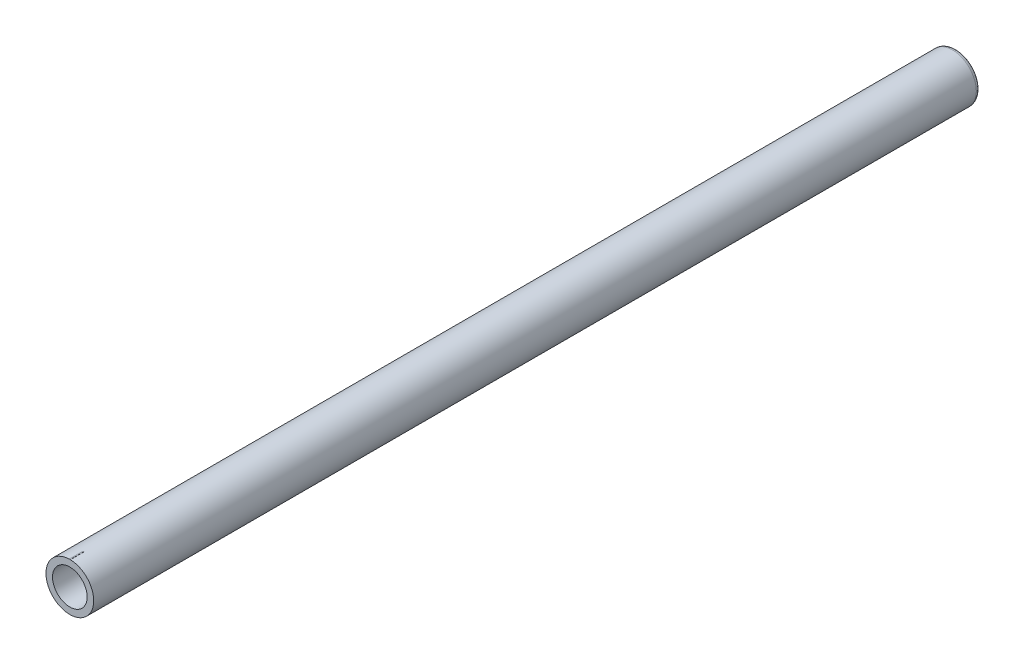
ISO-10303-21;
HEADER;
FILE_DESCRIPTION(('STEP AP214'),'2;1');
FILE_NAME('part.step','',(''),(''),'','','');
FILE_SCHEMA(('AUTOMOTIVE_DESIGN { 1 0 10303 214 1 1 1 1 }'));
ENDSEC;
DATA;
#1=APPLICATION_CONTEXT('core data for automotive mechanical design processes');
#2=APPLICATION_PROTOCOL_DEFINITION('international standard','automotive_design',2000,#1);
#3=PRODUCT_CONTEXT('',#1,'mechanical');
#4=PRODUCT('Part','Part','',(#3));
#5=PRODUCT_RELATED_PRODUCT_CATEGORY('part','',(#4));
#6=PRODUCT_DEFINITION_FORMATION('','',#4);
#7=PRODUCT_DEFINITION_CONTEXT('part definition',#1,'design');
#8=PRODUCT_DEFINITION('design','',#6,#7);
#9=PRODUCT_DEFINITION_SHAPE('','',#8);
#10=(LENGTH_UNIT() NAMED_UNIT(*) SI_UNIT(.MILLI.,.METRE.));
#11=(NAMED_UNIT(*) PLANE_ANGLE_UNIT() SI_UNIT($,.RADIAN.));
#12=(NAMED_UNIT(*) SI_UNIT($,.STERADIAN.) SOLID_ANGLE_UNIT());
#13=UNCERTAINTY_MEASURE_WITH_UNIT(LENGTH_MEASURE(1.E-05),#10,'distance_accuracy_value','');
#14=(GEOMETRIC_REPRESENTATION_CONTEXT(3) GLOBAL_UNCERTAINTY_ASSIGNED_CONTEXT((#13)) GLOBAL_UNIT_ASSIGNED_CONTEXT((#10,
#11,#12)) REPRESENTATION_CONTEXT('',''));
#15=CARTESIAN_POINT('',(0.,0.,0.));
#16=DIRECTION('',(0.,0.,1.));
#17=DIRECTION('',(1.,0.,0.));
#18=AXIS2_PLACEMENT_3D('',#15,#16,#17);
#19=CARTESIAN_POINT('',(0.,0.,-650.));
#20=DIRECTION('',(0.,0.,1.));
#21=DIRECTION('',(1.,0.,0.));
#22=AXIS2_PLACEMENT_3D('',#19,#20,#21);
#23=CYLINDRICAL_SURFACE('',#22,17.5);
#24=DIRECTION('',(0.,0.,1.));
#25=VECTOR('',#24,1.);
#26=CARTESIAN_POINT('',(0.367368750009311,17.4961435808442,-650.));
#27=LINE('',#26,#25);
#28=CARTESIAN_POINT('',(0.367368750009311,17.4961435808442,0.));
#29=VERTEX_POINT('',#28);
#30=CARTESIAN_POINT('',(0.367368750009311,17.4961435808442,-10.));
#31=VERTEX_POINT('',#30);
#32=EDGE_CURVE('E58',#29,#31,#27,.F.);
#33=ORIENTED_EDGE('',*,*,#32,.F.);
#34=CARTESIAN_POINT('',(0.,0.,0.));
#35=DIRECTION('',(0.,0.,1.));
#36=DIRECTION('',(1.,0.,0.));
#37=AXIS2_PLACEMENT_3D('',#34,#35,#36);
#38=CIRCLE('',#37,17.5);
#39=CARTESIAN_POINT('',(-0.367368750009311,17.4961435808442,0.));
#40=VERTEX_POINT('',#39);
#41=EDGE_CURVE('E110',#40,#29,#38,.T.);
#42=ORIENTED_EDGE('',*,*,#41,.F.);
#43=DIRECTION('',(0.,0.,1.));
#44=VECTOR('',#43,1.);
#45=CARTESIAN_POINT('',(-0.367368750009311,17.4961435808442,-650.));
#46=LINE('',#45,#44);
#47=CARTESIAN_POINT('',(-0.367368750009311,17.4961435808442,-10.));
#48=VERTEX_POINT('',#47);
#49=EDGE_CURVE('E102',#48,#40,#46,.T.);
#50=ORIENTED_EDGE('',*,*,#49,.F.);
#51=CARTESIAN_POINT('',(0.,0.,-10.));
#52=DIRECTION('',(0.,0.,1.));
#53=DIRECTION('',(1.,0.,0.));
#54=AXIS2_PLACEMENT_3D('',#51,#52,#53);
#55=CIRCLE('',#54,17.5);
#56=EDGE_CURVE('E11',#48,#31,#55,.F.);
#57=ORIENTED_EDGE('',*,*,#56,.T.);
#58=EDGE_LOOP('',(#33,#42,#50,#57));
#59=FACE_BOUND('',#58,.T.);
#60=CARTESIAN_POINT('',(0.,0.,-647.));
#61=DIRECTION('',(0.,0.,1.));
#62=DIRECTION('',(1.,0.,0.));
#63=AXIS2_PLACEMENT_3D('',#60,#61,#62);
#64=CIRCLE('',#63,17.5);
#65=CARTESIAN_POINT('',(17.5,0.,-647.));
#66=VERTEX_POINT('',#65);
#67=EDGE_CURVE('E114',#66,#66,#64,.T.);
#68=ORIENTED_EDGE('',*,*,#67,.T.);
#69=EDGE_LOOP('',(#68));
#70=FACE_BOUND('',#69,.T.);
#71=ADVANCED_FACE('F35',(#59,#70),#23,.T.);
#72=CARTESIAN_POINT('',(0.,0.,-650.));
#73=DIRECTION('',(0.,0.,1.));
#74=DIRECTION('',(1.,0.,0.));
#75=AXIS2_PLACEMENT_3D('',#72,#73,#74);
#76=PLANE('',#75);
#77=CARTESIAN_POINT('',(0.,0.,-650.));
#78=DIRECTION('',(0.,0.,1.));
#79=DIRECTION('',(1.,0.,0.));
#80=AXIS2_PLACEMENT_3D('',#77,#78,#79);
#81=CIRCLE('',#80,14.5);
#82=CARTESIAN_POINT('',(14.5,0.,-650.));
#83=VERTEX_POINT('',#82);
#84=EDGE_CURVE('E43',#83,#83,#81,.F.);
#85=ORIENTED_EDGE('',*,*,#84,.T.);
#86=EDGE_LOOP('',(#85));
#87=FACE_BOUND('',#86,.T.);
#88=ADVANCED_FACE('F119',(#87),#76,.F.);
#89=CARTESIAN_POINT('',(0.,0.,0.));
#90=DIRECTION('',(0.,0.,1.));
#91=DIRECTION('',(1.,0.,0.));
#92=AXIS2_PLACEMENT_3D('',#89,#90,#91);
#93=PLANE('',#92);
#94=ORIENTED_EDGE('',*,*,#41,.T.);
#95=DIRECTION('',(0.,1.,0.));
#96=VECTOR('',#95,1.);
#97=CARTESIAN_POINT('',(0.367368750009311,17.5943090338643,0.));
#98=LINE('',#97,#96);
#99=CARTESIAN_POINT('',(0.367368750009311,17.5943090338643,0.));
#100=VERTEX_POINT('',#99);
#101=EDGE_CURVE('E98',#29,#100,#98,.T.);
#102=ORIENTED_EDGE('',*,*,#101,.T.);
#103=DIRECTION('',(-1.,0.,0.));
#104=VECTOR('',#103,1.);
#105=CARTESIAN_POINT('',(-0.367368750009311,17.5943090338643,0.));
#106=LINE('',#105,#104);
#107=CARTESIAN_POINT('',(-0.367368750009311,17.5943090338643,0.));
#108=VERTEX_POINT('',#107);
#109=EDGE_CURVE('E88',#100,#108,#106,.T.);
#110=ORIENTED_EDGE('',*,*,#109,.T.);
#111=DIRECTION('',(0.,-1.,0.));
#112=VECTOR('',#111,1.);
#113=CARTESIAN_POINT('',(-0.367368750009311,17.5943090338643,0.));
#114=LINE('',#113,#112);
#115=EDGE_CURVE('E50',#108,#40,#114,.T.);
#116=ORIENTED_EDGE('',*,*,#115,.T.);
#117=EDGE_LOOP('',(#94,#102,#110,#116));
#118=FACE_BOUND('',#117,.T.);
#119=CARTESIAN_POINT('',(0.,0.,0.));
#120=DIRECTION('',(0.,0.,1.));
#121=DIRECTION('',(1.,0.,0.));
#122=AXIS2_PLACEMENT_3D('',#119,#120,#121);
#123=CIRCLE('',#122,12.7);
#124=CARTESIAN_POINT('',(12.7,0.,0.));
#125=VERTEX_POINT('',#124);
#126=EDGE_CURVE('E106',#125,#125,#123,.T.);
#127=ORIENTED_EDGE('',*,*,#126,.F.);
#128=EDGE_LOOP('',(#127));
#129=FACE_BOUND('',#128,.T.);
#130=ADVANCED_FACE('F133',(#118,#129),#93,.T.);
#131=CARTESIAN_POINT('',(0.,0.,-640.));
#132=DIRECTION('',(0.,0.,1.));
#133=DIRECTION('',(1.,0.,0.));
#134=AXIS2_PLACEMENT_3D('',#131,#132,#133);
#135=CYLINDRICAL_SURFACE('',#134,12.7);
#136=CARTESIAN_POINT('',(0.,0.,-640.));
#137=DIRECTION('',(0.,0.,1.));
#138=DIRECTION('',(1.,0.,0.));
#139=AXIS2_PLACEMENT_3D('',#136,#137,#138);
#140=CIRCLE('',#139,12.7);
#141=CARTESIAN_POINT('',(12.7,0.,-640.));
#142=VERTEX_POINT('',#141);
#143=EDGE_CURVE('E107',#142,#142,#140,.T.);
#144=ORIENTED_EDGE('',*,*,#143,.F.);
#145=EDGE_LOOP('',(#144));
#146=FACE_BOUND('',#145,.T.);
#147=ORIENTED_EDGE('',*,*,#126,.T.);
#148=EDGE_LOOP('',(#147));
#149=FACE_BOUND('',#148,.T.);
#150=ADVANCED_FACE('F137',(#146,#149),#135,.F.);
#151=CARTESIAN_POINT('',(0.,0.,-640.));
#152=DIRECTION('',(0.,0.,1.));
#153=DIRECTION('',(1.,0.,0.));
#154=AXIS2_PLACEMENT_3D('',#151,#152,#153);
#155=PLANE('',#154);
#156=ORIENTED_EDGE('',*,*,#143,.T.);
#157=EDGE_LOOP('',(#156));
#158=FACE_BOUND('',#157,.T.);
#159=ADVANCED_FACE('F123',(#158),#155,.T.);
#160=CARTESIAN_POINT('',(0.,0.,-647.));
#161=DIRECTION('',(0.,0.,1.));
#162=DIRECTION('',(1.,0.,0.));
#163=AXIS2_PLACEMENT_3D('',#160,#161,#162);
#164=TOROIDAL_SURFACE('',#163,14.5,3.);
#165=ORIENTED_EDGE('',*,*,#84,.F.);
#166=EDGE_LOOP('',(#165));
#167=FACE_BOUND('',#166,.T.);
#168=ORIENTED_EDGE('',*,*,#67,.F.);
#169=EDGE_LOOP('',(#168));
#170=FACE_BOUND('',#169,.T.);
#171=ADVANCED_FACE('F37',(#167,#170),#164,.T.);
#172=CARTESIAN_POINT('',(0.367368750009311,17.5943090338643,-10.));
#173=DIRECTION('',(1.,0.,0.));
#174=DIRECTION('',(0.,0.,-1.));
#175=AXIS2_PLACEMENT_3D('',#172,#173,#174);
#176=PLANE('',#175);
#177=ORIENTED_EDGE('',*,*,#101,.F.);
#178=ORIENTED_EDGE('',*,*,#32,.T.);
#179=DIRECTION('',(0.,1.,0.));
#180=VECTOR('',#179,1.);
#181=CARTESIAN_POINT('',(0.367368750009311,17.5943090338643,-10.));
#182=LINE('',#181,#180);
#183=CARTESIAN_POINT('',(0.367368750009311,17.5943090338643,-10.));
#184=VERTEX_POINT('',#183);
#185=EDGE_CURVE('E76',#31,#184,#182,.T.);
#186=ORIENTED_EDGE('',*,*,#185,.T.);
#187=DIRECTION('',(0.,0.,1.));
#188=VECTOR('',#187,1.);
#189=CARTESIAN_POINT('',(0.367368750009311,17.5943090338643,-10.));
#190=LINE('',#189,#188);
#191=EDGE_CURVE('E79',#184,#100,#190,.T.);
#192=ORIENTED_EDGE('',*,*,#191,.T.);
#193=EDGE_LOOP('',(#177,#178,#186,#192));
#194=FACE_BOUND('',#193,.T.);
#195=ADVANCED_FACE('F78',(#194),#176,.T.);
#196=CARTESIAN_POINT('',(-0.367368750009311,17.5943090338643,-10.));
#197=DIRECTION('',(-1.,0.,0.));
#198=DIRECTION('',(0.,0.,1.));
#199=AXIS2_PLACEMENT_3D('',#196,#197,#198);
#200=PLANE('',#199);
#201=DIRECTION('',(0.,-1.,0.));
#202=VECTOR('',#201,1.);
#203=CARTESIAN_POINT('',(-0.367368750009311,17.5943090338643,-10.));
#204=LINE('',#203,#202);
#205=CARTESIAN_POINT('',(-0.367368750009311,17.5943090338643,-10.));
#206=VERTEX_POINT('',#205);
#207=EDGE_CURVE('E90',#206,#48,#204,.T.);
#208=ORIENTED_EDGE('',*,*,#207,.T.);
#209=ORIENTED_EDGE('',*,*,#49,.T.);
#210=ORIENTED_EDGE('',*,*,#115,.F.);
#211=DIRECTION('',(0.,0.,1.));
#212=VECTOR('',#211,1.);
#213=CARTESIAN_POINT('',(-0.367368750009311,17.5943090338643,-10.));
#214=LINE('',#213,#212);
#215=EDGE_CURVE('E89',#206,#108,#214,.T.);
#216=ORIENTED_EDGE('',*,*,#215,.F.);
#217=EDGE_LOOP('',(#208,#209,#210,#216));
#218=FACE_BOUND('',#217,.T.);
#219=ADVANCED_FACE('F147',(#218),#200,.T.);
#220=CARTESIAN_POINT('',(-0.367368750009311,17.5943090338643,-10.));
#221=DIRECTION('',(0.,1.,0.));
#222=DIRECTION('',(0.,0.,1.));
#223=AXIS2_PLACEMENT_3D('',#220,#221,#222);
#224=PLANE('',#223);
#225=ORIENTED_EDGE('',*,*,#109,.F.);
#226=ORIENTED_EDGE('',*,*,#191,.F.);
#227=DIRECTION('',(-1.,0.,0.));
#228=VECTOR('',#227,1.);
#229=CARTESIAN_POINT('',(-0.367368750009311,17.5943090338643,-10.));
#230=LINE('',#229,#228);
#231=EDGE_CURVE('E83',#184,#206,#230,.T.);
#232=ORIENTED_EDGE('',*,*,#231,.T.);
#233=ORIENTED_EDGE('',*,*,#215,.T.);
#234=EDGE_LOOP('',(#225,#226,#232,#233));
#235=FACE_BOUND('',#234,.T.);
#236=ADVANCED_FACE('F87',(#235),#224,.T.);
#237=CARTESIAN_POINT('',(0.,0.,-10.));
#238=DIRECTION('',(0.,0.,1.));
#239=DIRECTION('',(1.,0.,0.));
#240=AXIS2_PLACEMENT_3D('',#237,#238,#239);
#241=PLANE('',#240);
#242=ORIENTED_EDGE('',*,*,#56,.F.);
#243=ORIENTED_EDGE('',*,*,#207,.F.);
#244=ORIENTED_EDGE('',*,*,#231,.F.);
#245=ORIENTED_EDGE('',*,*,#185,.F.);
#246=EDGE_LOOP('',(#242,#243,#244,#245));
#247=FACE_BOUND('',#246,.T.);
#248=ADVANCED_FACE('F93',(#247),#241,.F.);
#249=CLOSED_SHELL('',(#71,#88,#130,#150,#159,#171,#195,#219,#236,#248));
#250=MANIFOLD_SOLID_BREP('B2',#249);
#251=ADVANCED_BREP_SHAPE_REPRESENTATION('',(#18,#250),#14);
#252=SHAPE_DEFINITION_REPRESENTATION(#9,#251);
ENDSEC;
END-ISO-10303-21;
